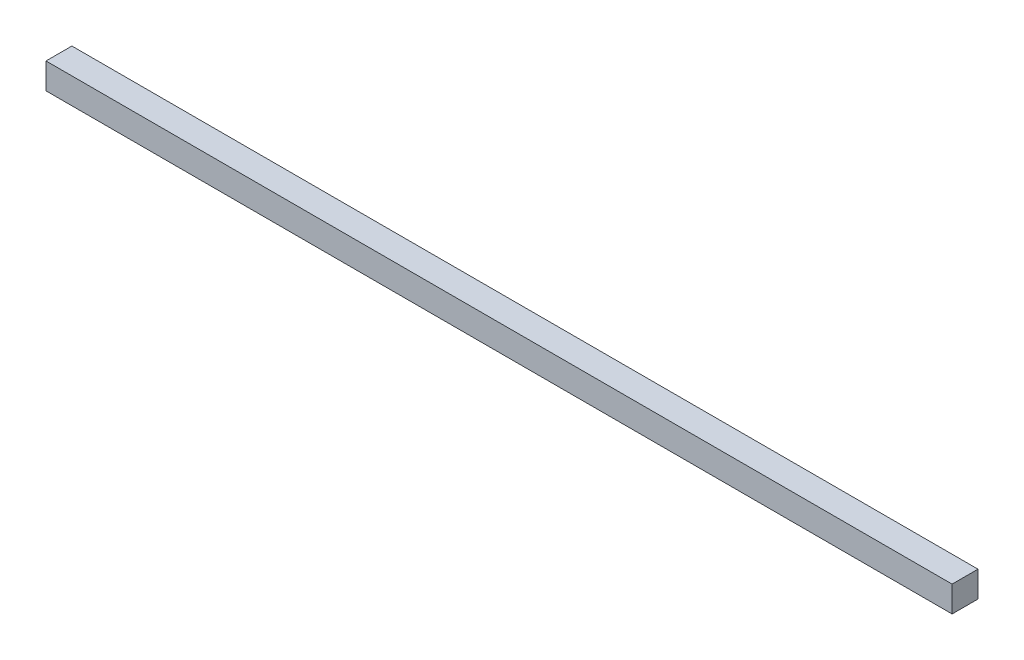
ISO-10303-21;
HEADER;
FILE_DESCRIPTION(('STEP AP214'),'2;1');
FILE_NAME('part.step','',(''),(''),'','','');
FILE_SCHEMA(('AUTOMOTIVE_DESIGN { 1 0 10303 214 1 1 1 1 }'));
ENDSEC;
DATA;
#1=APPLICATION_CONTEXT('core data for automotive mechanical design processes');
#2=APPLICATION_PROTOCOL_DEFINITION('international standard','automotive_design',2000,#1);
#3=PRODUCT_CONTEXT('',#1,'mechanical');
#4=PRODUCT('Part','Part','',(#3));
#5=PRODUCT_RELATED_PRODUCT_CATEGORY('part','',(#4));
#6=PRODUCT_DEFINITION_FORMATION('','',#4);
#7=PRODUCT_DEFINITION_CONTEXT('part definition',#1,'design');
#8=PRODUCT_DEFINITION('design','',#6,#7);
#9=PRODUCT_DEFINITION_SHAPE('','',#8);
#10=(LENGTH_UNIT() NAMED_UNIT(*) SI_UNIT(.MILLI.,.METRE.));
#11=(NAMED_UNIT(*) PLANE_ANGLE_UNIT() SI_UNIT($,.RADIAN.));
#12=(NAMED_UNIT(*) SI_UNIT($,.STERADIAN.) SOLID_ANGLE_UNIT());
#13=UNCERTAINTY_MEASURE_WITH_UNIT(LENGTH_MEASURE(1.E-05),#10,'distance_accuracy_value','');
#14=(GEOMETRIC_REPRESENTATION_CONTEXT(3) GLOBAL_UNCERTAINTY_ASSIGNED_CONTEXT((#13)) GLOBAL_UNIT_ASSIGNED_CONTEXT((#10,
#11,#12)) REPRESENTATION_CONTEXT('',''));
#15=CARTESIAN_POINT('',(0.,0.,0.));
#16=DIRECTION('',(0.,0.,1.));
#17=DIRECTION('',(1.,0.,0.));
#18=AXIS2_PLACEMENT_3D('',#15,#16,#17);
#19=CARTESIAN_POINT('',(-32.9974333662389,10.7943731490622,2.54));
#20=DIRECTION('',(1.,0.,0.));
#21=DIRECTION('',(0.,0.,-1.));
#22=AXIS2_PLACEMENT_3D('',#19,#20,#21);
#23=PLANE('',#22);
#24=DIRECTION('',(0.,-1.,0.));
#25=VECTOR('',#24,1.);
#26=CARTESIAN_POINT('',(-32.9974333662389,10.7943731490622,0.));
#27=LINE('',#26,#25);
#28=CARTESIAN_POINT('',(-32.9974333662389,10.7943731490622,0.));
#29=VERTEX_POINT('',#28);
#30=CARTESIAN_POINT('',(-32.9974333662389,8.25437314906219,0.));
#31=VERTEX_POINT('',#30);
#32=EDGE_CURVE('E98',#29,#31,#27,.T.);
#33=ORIENTED_EDGE('',*,*,#32,.T.);
#34=DIRECTION('',(0.,0.,-1.));
#35=VECTOR('',#34,1.);
#36=CARTESIAN_POINT('',(-32.9974333662389,8.25437314906219,2.54));
#37=LINE('',#36,#35);
#38=CARTESIAN_POINT('',(-32.9974333662389,8.25437314906219,2.54));
#39=VERTEX_POINT('',#38);
#40=EDGE_CURVE('E11',#39,#31,#37,.T.);
#41=ORIENTED_EDGE('',*,*,#40,.F.);
#42=DIRECTION('',(0.,-1.,0.));
#43=VECTOR('',#42,1.);
#44=CARTESIAN_POINT('',(-32.9974333662389,10.7943731490622,2.54));
#45=LINE('',#44,#43);
#46=CARTESIAN_POINT('',(-32.9974333662389,10.7943731490622,2.54));
#47=VERTEX_POINT('',#46);
#48=EDGE_CURVE('E86',#47,#39,#45,.T.);
#49=ORIENTED_EDGE('',*,*,#48,.F.);
#50=DIRECTION('',(0.,0.,-1.));
#51=VECTOR('',#50,1.);
#52=CARTESIAN_POINT('',(-32.9974333662389,10.7943731490622,2.54));
#53=LINE('',#52,#51);
#54=EDGE_CURVE('E94',#47,#29,#53,.T.);
#55=ORIENTED_EDGE('',*,*,#54,.T.);
#56=EDGE_LOOP('',(#33,#41,#49,#55));
#57=FACE_BOUND('',#56,.T.);
#58=ADVANCED_FACE('F35',(#57),#23,.F.);
#59=CARTESIAN_POINT('',(-32.9974333662389,8.25437314906219,2.54));
#60=DIRECTION('',(0.,1.,0.));
#61=DIRECTION('',(0.,0.,1.));
#62=AXIS2_PLACEMENT_3D('',#59,#60,#61);
#63=PLANE('',#62);
#64=DIRECTION('',(1.,0.,0.));
#65=VECTOR('',#64,1.);
#66=CARTESIAN_POINT('',(-32.9974333662389,8.25437314906219,0.));
#67=LINE('',#66,#65);
#68=CARTESIAN_POINT('',(55.9025666337611,8.25437314906219,0.));
#69=VERTEX_POINT('',#68);
#70=EDGE_CURVE('E90',#31,#69,#67,.T.);
#71=ORIENTED_EDGE('',*,*,#70,.T.);
#72=DIRECTION('',(0.,0.,-1.));
#73=VECTOR('',#72,1.);
#74=CARTESIAN_POINT('',(55.9025666337611,8.25437314906219,2.54));
#75=LINE('',#74,#73);
#76=CARTESIAN_POINT('',(55.9025666337611,8.25437314906219,2.54));
#77=VERTEX_POINT('',#76);
#78=EDGE_CURVE('E43',#77,#69,#75,.T.);
#79=ORIENTED_EDGE('',*,*,#78,.F.);
#80=DIRECTION('',(1.,0.,0.));
#81=VECTOR('',#80,1.);
#82=CARTESIAN_POINT('',(-32.9974333662389,8.25437314906219,2.54));
#83=LINE('',#82,#81);
#84=EDGE_CURVE('E81',#39,#77,#83,.T.);
#85=ORIENTED_EDGE('',*,*,#84,.F.);
#86=ORIENTED_EDGE('',*,*,#40,.T.);
#87=EDGE_LOOP('',(#71,#79,#85,#86));
#88=FACE_BOUND('',#87,.T.);
#89=ADVANCED_FACE('F89',(#88),#63,.F.);
#90=CARTESIAN_POINT('',(55.9025666337611,10.7943731490622,2.54));
#91=DIRECTION('',(-1.,0.,0.));
#92=DIRECTION('',(0.,-1.,0.));
#93=AXIS2_PLACEMENT_3D('',#90,#91,#92);
#94=PLANE('',#93);
#95=DIRECTION('',(0.,1.,0.));
#96=VECTOR('',#95,1.);
#97=CARTESIAN_POINT('',(55.9025666337611,10.7943731490622,0.));
#98=LINE('',#97,#96);
#99=CARTESIAN_POINT('',(55.9025666337611,10.7943731490622,0.));
#100=VERTEX_POINT('',#99);
#101=EDGE_CURVE('E68',#69,#100,#98,.T.);
#102=ORIENTED_EDGE('',*,*,#101,.T.);
#103=DIRECTION('',(0.,0.,-1.));
#104=VECTOR('',#103,1.);
#105=CARTESIAN_POINT('',(55.9025666337611,10.7943731490622,2.54));
#106=LINE('',#105,#104);
#107=CARTESIAN_POINT('',(55.9025666337611,10.7943731490622,2.54));
#108=VERTEX_POINT('',#107);
#109=EDGE_CURVE('E91',#108,#100,#106,.T.);
#110=ORIENTED_EDGE('',*,*,#109,.F.);
#111=DIRECTION('',(0.,1.,0.));
#112=VECTOR('',#111,1.);
#113=CARTESIAN_POINT('',(55.9025666337611,10.7943731490622,2.54));
#114=LINE('',#113,#112);
#115=EDGE_CURVE('E84',#77,#108,#114,.T.);
#116=ORIENTED_EDGE('',*,*,#115,.F.);
#117=ORIENTED_EDGE('',*,*,#78,.T.);
#118=EDGE_LOOP('',(#102,#110,#116,#117));
#119=FACE_BOUND('',#118,.T.);
#120=ADVANCED_FACE('F92',(#119),#94,.F.);
#121=CARTESIAN_POINT('',(-32.9974333662389,10.7943731490622,2.54));
#122=DIRECTION('',(0.,-1.,0.));
#123=DIRECTION('',(0.,0.,-1.));
#124=AXIS2_PLACEMENT_3D('',#121,#122,#123);
#125=PLANE('',#124);
#126=DIRECTION('',(-1.,0.,0.));
#127=VECTOR('',#126,1.);
#128=CARTESIAN_POINT('',(-32.9974333662389,10.7943731490622,0.));
#129=LINE('',#128,#127);
#130=EDGE_CURVE('E74',#100,#29,#129,.T.);
#131=ORIENTED_EDGE('',*,*,#130,.T.);
#132=ORIENTED_EDGE('',*,*,#54,.F.);
#133=DIRECTION('',(-1.,0.,0.));
#134=VECTOR('',#133,1.);
#135=CARTESIAN_POINT('',(-32.9974333662389,10.7943731490622,2.54));
#136=LINE('',#135,#134);
#137=EDGE_CURVE('E51',#108,#47,#136,.T.);
#138=ORIENTED_EDGE('',*,*,#137,.F.);
#139=ORIENTED_EDGE('',*,*,#109,.T.);
#140=EDGE_LOOP('',(#131,#132,#138,#139));
#141=FACE_BOUND('',#140,.T.);
#142=ADVANCED_FACE('F105',(#141),#125,.F.);
#143=CARTESIAN_POINT('',(0.,0.,2.54));
#144=DIRECTION('',(0.,0.,1.));
#145=DIRECTION('',(1.,0.,0.));
#146=AXIS2_PLACEMENT_3D('',#143,#144,#145);
#147=PLANE('',#146);
#148=ORIENTED_EDGE('',*,*,#48,.T.);
#149=ORIENTED_EDGE('',*,*,#84,.T.);
#150=ORIENTED_EDGE('',*,*,#115,.T.);
#151=ORIENTED_EDGE('',*,*,#137,.T.);
#152=EDGE_LOOP('',(#148,#149,#150,#151));
#153=FACE_BOUND('',#152,.T.);
#154=ADVANCED_FACE('F82',(#153),#147,.T.);
#155=CARTESIAN_POINT('',(0.,0.,0.));
#156=DIRECTION('',(0.,0.,1.));
#157=DIRECTION('',(1.,0.,0.));
#158=AXIS2_PLACEMENT_3D('',#155,#156,#157);
#159=PLANE('',#158);
#160=ORIENTED_EDGE('',*,*,#32,.F.);
#161=ORIENTED_EDGE('',*,*,#130,.F.);
#162=ORIENTED_EDGE('',*,*,#101,.F.);
#163=ORIENTED_EDGE('',*,*,#70,.F.);
#164=EDGE_LOOP('',(#160,#161,#162,#163));
#165=FACE_BOUND('',#164,.T.);
#166=ADVANCED_FACE('F108',(#165),#159,.F.);
#167=CLOSED_SHELL('',(#58,#89,#120,#142,#154,#166));
#168=MANIFOLD_SOLID_BREP('B2',#167);
#169=ADVANCED_BREP_SHAPE_REPRESENTATION('',(#18,#168),#14);
#170=SHAPE_DEFINITION_REPRESENTATION(#9,#169);
ENDSEC;
END-ISO-10303-21;
